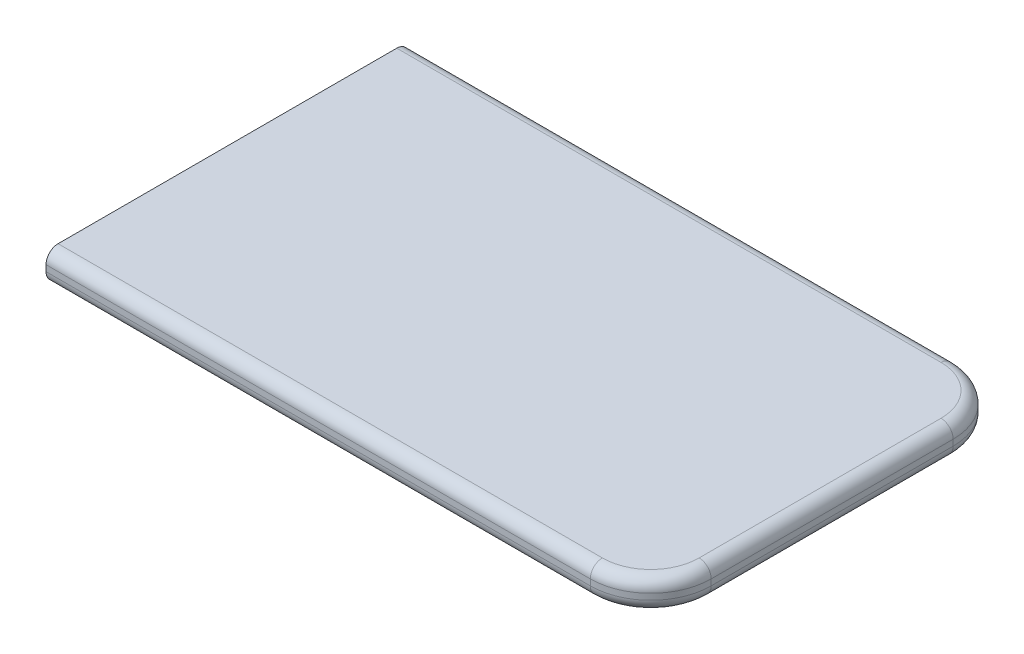
ISO-10303-21;
HEADER;
FILE_DESCRIPTION(('STEP AP214'),'2;1');
FILE_NAME('part.step','',(''),(''),'','','');
FILE_SCHEMA(('AUTOMOTIVE_DESIGN { 1 0 10303 214 1 1 1 1 }'));
ENDSEC;
DATA;
#1=APPLICATION_CONTEXT('core data for automotive mechanical design processes');
#2=APPLICATION_PROTOCOL_DEFINITION('international standard','automotive_design',2000,#1);
#3=PRODUCT_CONTEXT('',#1,'mechanical');
#4=PRODUCT('Part','Part','',(#3));
#5=PRODUCT_RELATED_PRODUCT_CATEGORY('part','',(#4));
#6=PRODUCT_DEFINITION_FORMATION('','',#4);
#7=PRODUCT_DEFINITION_CONTEXT('part definition',#1,'design');
#8=PRODUCT_DEFINITION('design','',#6,#7);
#9=PRODUCT_DEFINITION_SHAPE('','',#8);
#10=(LENGTH_UNIT() NAMED_UNIT(*) SI_UNIT(.MILLI.,.METRE.));
#11=(NAMED_UNIT(*) PLANE_ANGLE_UNIT() SI_UNIT($,.RADIAN.));
#12=(NAMED_UNIT(*) SI_UNIT($,.STERADIAN.) SOLID_ANGLE_UNIT());
#13=UNCERTAINTY_MEASURE_WITH_UNIT(LENGTH_MEASURE(1.E-05),#10,'distance_accuracy_value','');
#14=(GEOMETRIC_REPRESENTATION_CONTEXT(3) GLOBAL_UNCERTAINTY_ASSIGNED_CONTEXT((#13)) GLOBAL_UNIT_ASSIGNED_CONTEXT((#10,
#11,#12)) REPRESENTATION_CONTEXT('',''));
#15=CARTESIAN_POINT('',(0.,0.,0.));
#16=DIRECTION('',(0.,0.,1.));
#17=DIRECTION('',(1.,0.,0.));
#18=AXIS2_PLACEMENT_3D('',#15,#16,#17);
#19=CARTESIAN_POINT('',(0.,50.,0.));
#20=DIRECTION('',(-1.,0.,0.));
#21=DIRECTION('',(0.,0.,1.));
#22=AXIS2_PLACEMENT_3D('',#19,#20,#21);
#23=PLANE('',#22);
#24=DIRECTION('',(0.,-1.,0.));
#25=VECTOR('',#24,1.);
#26=CARTESIAN_POINT('',(0.,0.,-100.));
#27=LINE('',#26,#25);
#28=CARTESIAN_POINT('',(0.,30.,-100.));
#29=VERTEX_POINT('',#28);
#30=CARTESIAN_POINT('',(0.,20.,-100.));
#31=VERTEX_POINT('',#30);
#32=EDGE_CURVE('E156',#29,#31,#27,.T.);
#33=ORIENTED_EDGE('',*,*,#32,.T.);
#34=DIRECTION('',(0.,0.,-1.));
#35=VECTOR('',#34,1.);
#36=CARTESIAN_POINT('',(0.,20.,0.));
#37=LINE('',#36,#35);
#38=CARTESIAN_POINT('',(0.,20.,-500.));
#39=VERTEX_POINT('',#38);
#40=EDGE_CURVE('E272',#31,#39,#37,.T.);
#41=ORIENTED_EDGE('',*,*,#40,.T.);
#42=DIRECTION('',(0.,-1.,0.));
#43=VECTOR('',#42,1.);
#44=CARTESIAN_POINT('',(0.,50.,-500.));
#45=LINE('',#44,#43);
#46=CARTESIAN_POINT('',(0.,30.,-500.));
#47=VERTEX_POINT('',#46);
#48=EDGE_CURVE('E233',#39,#47,#45,.F.);
#49=ORIENTED_EDGE('',*,*,#48,.T.);
#50=DIRECTION('',(0.,0.,-1.));
#51=VECTOR('',#50,1.);
#52=CARTESIAN_POINT('',(0.,30.,-100.));
#53=LINE('',#52,#51);
#54=EDGE_CURVE('E269',#47,#29,#53,.F.);
#55=ORIENTED_EDGE('',*,*,#54,.T.);
#56=EDGE_LOOP('',(#33,#41,#49,#55));
#57=FACE_BOUND('',#56,.T.);
#58=ADVANCED_FACE('F41',(#57),#23,.F.);
#59=CARTESIAN_POINT('',(0.,50.,-600.));
#60=DIRECTION('',(0.,0.,1.));
#61=DIRECTION('',(1.,0.,0.));
#62=AXIS2_PLACEMENT_3D('',#59,#60,#61);
#63=PLANE('',#62);
#64=DIRECTION('',(0.,-1.,0.));
#65=VECTOR('',#64,1.);
#66=CARTESIAN_POINT('',(-100.,50.,-600.));
#67=LINE('',#66,#65);
#68=CARTESIAN_POINT('',(-100.,30.,-600.));
#69=VERTEX_POINT('',#68);
#70=CARTESIAN_POINT('',(-100.,20.,-600.));
#71=VERTEX_POINT('',#70);
#72=EDGE_CURVE('E137',#69,#71,#67,.T.);
#73=ORIENTED_EDGE('',*,*,#72,.T.);
#74=DIRECTION('',(-1.,0.,0.));
#75=VECTOR('',#74,1.);
#76=CARTESIAN_POINT('',(0.,20.,-600.));
#77=LINE('',#76,#75);
#78=CARTESIAN_POINT('',(-1000.,20.,-600.));
#79=VERTEX_POINT('',#78);
#80=EDGE_CURVE('E144',#71,#79,#77,.T.);
#81=ORIENTED_EDGE('',*,*,#80,.T.);
#82=DIRECTION('',(0.,-1.,0.));
#83=VECTOR('',#82,1.);
#84=CARTESIAN_POINT('',(-1000.,50.,-600.));
#85=LINE('',#84,#83);
#86=CARTESIAN_POINT('',(-1000.,30.,-600.));
#87=VERTEX_POINT('',#86);
#88=EDGE_CURVE('E140',#87,#79,#85,.T.);
#89=ORIENTED_EDGE('',*,*,#88,.F.);
#90=DIRECTION('',(-1.,0.,0.));
#91=VECTOR('',#90,1.);
#92=CARTESIAN_POINT('',(-100.,30.,-600.));
#93=LINE('',#92,#91);
#94=EDGE_CURVE('E133',#87,#69,#93,.F.);
#95=ORIENTED_EDGE('',*,*,#94,.T.);
#96=EDGE_LOOP('',(#73,#81,#89,#95));
#97=FACE_BOUND('',#96,.T.);
#98=ADVANCED_FACE('F135',(#97),#63,.F.);
#99=CARTESIAN_POINT('',(-1000.,50.,1.22464679914735E-13));
#100=DIRECTION('',(-1.,0.,0.));
#101=DIRECTION('',(0.,0.,1.));
#102=AXIS2_PLACEMENT_3D('',#99,#100,#101);
#103=PLANE('',#102);
#104=ORIENTED_EDGE('',*,*,#88,.T.);
#105=CARTESIAN_POINT('',(-1000.,20.,-580.));
#106=DIRECTION('',(-1.,0.,0.));
#107=DIRECTION('',(0.,0.,1.));
#108=AXIS2_PLACEMENT_3D('',#105,#106,#107);
#109=CIRCLE('',#108,20.);
#110=CARTESIAN_POINT('',(-1000.,0.,-580.));
#111=VERTEX_POINT('',#110);
#112=EDGE_CURVE('E250',#79,#111,#109,.T.);
#113=ORIENTED_EDGE('',*,*,#112,.T.);
#114=DIRECTION('',(0.,0.,-1.));
#115=VECTOR('',#114,1.);
#116=CARTESIAN_POINT('',(-1000.,0.,1.22464679914735E-13));
#117=LINE('',#116,#115);
#118=CARTESIAN_POINT('',(-1000.,0.,-19.9999999999999));
#119=VERTEX_POINT('',#118);
#120=EDGE_CURVE('E209',#119,#111,#117,.T.);
#121=ORIENTED_EDGE('',*,*,#120,.F.);
#122=CARTESIAN_POINT('',(-1000.,20.,-19.9999999999999));
#123=DIRECTION('',(-1.,0.,0.));
#124=DIRECTION('',(0.,0.,1.));
#125=AXIS2_PLACEMENT_3D('',#122,#123,#124);
#126=CIRCLE('',#125,20.);
#127=CARTESIAN_POINT('',(-1000.,20.,1.22464679914735E-13));
#128=VERTEX_POINT('',#127);
#129=EDGE_CURVE('E244',#119,#128,#126,.T.);
#130=ORIENTED_EDGE('',*,*,#129,.T.);
#131=DIRECTION('',(0.,-1.,0.));
#132=VECTOR('',#131,1.);
#133=CARTESIAN_POINT('',(-1000.,50.,1.22464679914735E-13));
#134=LINE('',#133,#132);
#135=CARTESIAN_POINT('',(-1000.,30.,1.22464679914735E-13));
#136=VERTEX_POINT('',#135);
#137=EDGE_CURVE('E222',#136,#128,#134,.T.);
#138=ORIENTED_EDGE('',*,*,#137,.F.);
#139=CARTESIAN_POINT('',(-1000.,30.,-19.9999999999999));
#140=DIRECTION('',(-1.,0.,0.));
#141=DIRECTION('',(0.,0.,1.));
#142=AXIS2_PLACEMENT_3D('',#139,#140,#141);
#143=CIRCLE('',#142,20.);
#144=CARTESIAN_POINT('',(-1000.,50.,-19.9999999999999));
#145=VERTEX_POINT('',#144);
#146=EDGE_CURVE('E241',#136,#145,#143,.T.);
#147=ORIENTED_EDGE('',*,*,#146,.T.);
#148=DIRECTION('',(0.,0.,-1.));
#149=VECTOR('',#148,1.);
#150=CARTESIAN_POINT('',(-1000.,50.,1.22464679914735E-13));
#151=LINE('',#150,#149);
#152=CARTESIAN_POINT('',(-1000.,50.,-580.));
#153=VERTEX_POINT('',#152);
#154=EDGE_CURVE('E216',#145,#153,#151,.T.);
#155=ORIENTED_EDGE('',*,*,#154,.T.);
#156=CARTESIAN_POINT('',(-1000.,30.,-580.));
#157=DIRECTION('',(-1.,0.,0.));
#158=DIRECTION('',(0.,0.,1.));
#159=AXIS2_PLACEMENT_3D('',#156,#157,#158);
#160=CIRCLE('',#159,20.);
#161=EDGE_CURVE('E247',#153,#87,#160,.T.);
#162=ORIENTED_EDGE('',*,*,#161,.T.);
#163=EDGE_LOOP('',(#104,#113,#121,#130,#138,#147,#155,#162));
#164=FACE_BOUND('',#163,.T.);
#165=ADVANCED_FACE('F302',(#164),#103,.T.);
#166=CARTESIAN_POINT('',(0.,50.,0.));
#167=DIRECTION('',(0.,0.,1.));
#168=DIRECTION('',(1.,0.,0.));
#169=AXIS2_PLACEMENT_3D('',#166,#167,#168);
#170=PLANE('',#169);
#171=ORIENTED_EDGE('',*,*,#137,.T.);
#172=DIRECTION('',(-1.,0.,0.));
#173=VECTOR('',#172,1.);
#174=CARTESIAN_POINT('',(-100.,20.,0.));
#175=LINE('',#174,#173);
#176=CARTESIAN_POINT('',(-100.,20.,0.));
#177=VERTEX_POINT('',#176);
#178=EDGE_CURVE('E11',#128,#177,#175,.F.);
#179=ORIENTED_EDGE('',*,*,#178,.T.);
#180=DIRECTION('',(0.,-1.,0.));
#181=VECTOR('',#180,1.);
#182=CARTESIAN_POINT('',(-100.,50.,0.));
#183=LINE('',#182,#181);
#184=CARTESIAN_POINT('',(-100.,30.,0.));
#185=VERTEX_POINT('',#184);
#186=EDGE_CURVE('E145',#177,#185,#183,.F.);
#187=ORIENTED_EDGE('',*,*,#186,.T.);
#188=DIRECTION('',(-1.,0.,0.));
#189=VECTOR('',#188,1.);
#190=CARTESIAN_POINT('',(0.,30.,0.));
#191=LINE('',#190,#189);
#192=EDGE_CURVE('E51',#185,#136,#191,.T.);
#193=ORIENTED_EDGE('',*,*,#192,.T.);
#194=EDGE_LOOP('',(#171,#179,#187,#193));
#195=FACE_BOUND('',#194,.T.);
#196=ADVANCED_FACE('F296',(#195),#170,.T.);
#197=CARTESIAN_POINT('',(0.,50.,0.));
#198=DIRECTION('',(0.,1.,0.));
#199=DIRECTION('',(0.,0.,1.));
#200=AXIS2_PLACEMENT_3D('',#197,#198,#199);
#201=PLANE('',#200);
#202=CARTESIAN_POINT('',(-100.,50.,-500.));
#203=DIRECTION('',(0.,1.,0.));
#204=DIRECTION('',(0.,0.,1.));
#205=AXIS2_PLACEMENT_3D('',#202,#203,#204);
#206=CIRCLE('',#205,80.);
#207=CARTESIAN_POINT('',(-20.,50.,-500.));
#208=VERTEX_POINT('',#207);
#209=CARTESIAN_POINT('',(-100.,50.,-580.));
#210=VERTEX_POINT('',#209);
#211=EDGE_CURVE('E59',#208,#210,#206,.T.);
#212=ORIENTED_EDGE('',*,*,#211,.T.);
#213=DIRECTION('',(-1.,0.,0.));
#214=VECTOR('',#213,1.);
#215=CARTESIAN_POINT('',(-1000.,50.,-580.));
#216=LINE('',#215,#214);
#217=EDGE_CURVE('E168',#210,#153,#216,.T.);
#218=ORIENTED_EDGE('',*,*,#217,.T.);
#219=ORIENTED_EDGE('',*,*,#154,.F.);
#220=DIRECTION('',(-1.,0.,0.));
#221=VECTOR('',#220,1.);
#222=CARTESIAN_POINT('',(0.,50.,-20.));
#223=LINE('',#222,#221);
#224=CARTESIAN_POINT('',(-100.,50.,-20.));
#225=VERTEX_POINT('',#224);
#226=EDGE_CURVE('E281',#145,#225,#223,.F.);
#227=ORIENTED_EDGE('',*,*,#226,.T.);
#228=CARTESIAN_POINT('',(-100.,50.,-100.));
#229=DIRECTION('',(0.,1.,0.));
#230=DIRECTION('',(0.,0.,1.));
#231=AXIS2_PLACEMENT_3D('',#228,#229,#230);
#232=CIRCLE('',#231,80.);
#233=CARTESIAN_POINT('',(-20.,50.,-100.));
#234=VERTEX_POINT('',#233);
#235=EDGE_CURVE('E284',#225,#234,#232,.T.);
#236=ORIENTED_EDGE('',*,*,#235,.T.);
#237=DIRECTION('',(0.,0.,-1.));
#238=VECTOR('',#237,1.);
#239=CARTESIAN_POINT('',(-20.,50.,-500.));
#240=LINE('',#239,#238);
#241=EDGE_CURVE('E64',#234,#208,#240,.T.);
#242=ORIENTED_EDGE('',*,*,#241,.T.);
#243=EDGE_LOOP('',(#212,#218,#219,#227,#236,#242));
#244=FACE_BOUND('',#243,.T.);
#245=ADVANCED_FACE('F306',(#244),#201,.T.);
#246=CARTESIAN_POINT('',(0.,0.,0.));
#247=DIRECTION('',(0.,1.,0.));
#248=DIRECTION('',(0.,0.,1.));
#249=AXIS2_PLACEMENT_3D('',#246,#247,#248);
#250=PLANE('',#249);
#251=ORIENTED_EDGE('',*,*,#120,.T.);
#252=DIRECTION('',(-1.,0.,0.));
#253=VECTOR('',#252,1.);
#254=CARTESIAN_POINT('',(0.,0.,-580.));
#255=LINE('',#254,#253);
#256=CARTESIAN_POINT('',(-100.,0.,-580.));
#257=VERTEX_POINT('',#256);
#258=EDGE_CURVE('E165',#111,#257,#255,.F.);
#259=ORIENTED_EDGE('',*,*,#258,.T.);
#260=CARTESIAN_POINT('',(-100.,0.,-500.));
#261=DIRECTION('',(0.,1.,0.));
#262=DIRECTION('',(0.,0.,1.));
#263=AXIS2_PLACEMENT_3D('',#260,#261,#262);
#264=CIRCLE('',#263,80.);
#265=CARTESIAN_POINT('',(-20.,0.,-500.));
#266=VERTEX_POINT('',#265);
#267=EDGE_CURVE('E262',#257,#266,#264,.F.);
#268=ORIENTED_EDGE('',*,*,#267,.T.);
#269=DIRECTION('',(0.,0.,-1.));
#270=VECTOR('',#269,1.);
#271=CARTESIAN_POINT('',(-20.,0.,0.));
#272=LINE('',#271,#270);
#273=CARTESIAN_POINT('',(-20.,0.,-100.));
#274=VERTEX_POINT('',#273);
#275=EDGE_CURVE('E259',#266,#274,#272,.F.);
#276=ORIENTED_EDGE('',*,*,#275,.T.);
#277=CARTESIAN_POINT('',(-100.,0.,-100.));
#278=DIRECTION('',(0.,1.,0.));
#279=DIRECTION('',(0.,0.,1.));
#280=AXIS2_PLACEMENT_3D('',#277,#278,#279);
#281=CIRCLE('',#280,80.);
#282=CARTESIAN_POINT('',(-100.,0.,-20.));
#283=VERTEX_POINT('',#282);
#284=EDGE_CURVE('E256',#274,#283,#281,.F.);
#285=ORIENTED_EDGE('',*,*,#284,.T.);
#286=DIRECTION('',(-1.,0.,0.));
#287=VECTOR('',#286,1.);
#288=CARTESIAN_POINT('',(-1000.,0.,-19.9999999999999));
#289=LINE('',#288,#287);
#290=EDGE_CURVE('E253',#283,#119,#289,.T.);
#291=ORIENTED_EDGE('',*,*,#290,.T.);
#292=EDGE_LOOP('',(#251,#259,#268,#276,#285,#291));
#293=FACE_BOUND('',#292,.T.);
#294=ADVANCED_FACE('F309',(#293),#250,.F.);
#295=CARTESIAN_POINT('',(-100.,50.,-500.));
#296=DIRECTION('',(0.,-1.,0.));
#297=DIRECTION('',(0.,0.,-1.));
#298=AXIS2_PLACEMENT_3D('',#295,#296,#297);
#299=CYLINDRICAL_SURFACE('',#298,100.);
#300=ORIENTED_EDGE('',*,*,#48,.F.);
#301=CARTESIAN_POINT('',(-100.,20.,-500.));
#302=DIRECTION('',(0.,1.,0.));
#303=DIRECTION('',(0.,0.,1.));
#304=AXIS2_PLACEMENT_3D('',#301,#302,#303);
#305=CIRCLE('',#304,100.);
#306=EDGE_CURVE('E154',#39,#71,#305,.T.);
#307=ORIENTED_EDGE('',*,*,#306,.T.);
#308=ORIENTED_EDGE('',*,*,#72,.F.);
#309=CARTESIAN_POINT('',(-100.,30.,-500.));
#310=DIRECTION('',(0.,1.,0.));
#311=DIRECTION('',(0.,0.,1.));
#312=AXIS2_PLACEMENT_3D('',#309,#310,#311);
#313=CIRCLE('',#312,100.);
#314=EDGE_CURVE('E151',#69,#47,#313,.F.);
#315=ORIENTED_EDGE('',*,*,#314,.T.);
#316=EDGE_LOOP('',(#300,#307,#308,#315));
#317=FACE_BOUND('',#316,.T.);
#318=ADVANCED_FACE('F150',(#317),#299,.T.);
#319=CARTESIAN_POINT('',(-100.,50.,-100.));
#320=DIRECTION('',(0.,1.,0.));
#321=DIRECTION('',(0.,0.,1.));
#322=AXIS2_PLACEMENT_3D('',#319,#320,#321);
#323=CYLINDRICAL_SURFACE('',#322,100.);
#324=ORIENTED_EDGE('',*,*,#186,.F.);
#325=CARTESIAN_POINT('',(-100.,20.,-100.));
#326=DIRECTION('',(0.,1.,0.));
#327=DIRECTION('',(0.,0.,1.));
#328=AXIS2_PLACEMENT_3D('',#325,#326,#327);
#329=CIRCLE('',#328,100.);
#330=EDGE_CURVE('E278',#177,#31,#329,.T.);
#331=ORIENTED_EDGE('',*,*,#330,.T.);
#332=ORIENTED_EDGE('',*,*,#32,.F.);
#333=CARTESIAN_POINT('',(-100.,30.,-100.));
#334=DIRECTION('',(0.,1.,0.));
#335=DIRECTION('',(0.,0.,1.));
#336=AXIS2_PLACEMENT_3D('',#333,#334,#335);
#337=CIRCLE('',#336,100.);
#338=EDGE_CURVE('E275',#29,#185,#337,.F.);
#339=ORIENTED_EDGE('',*,*,#338,.T.);
#340=EDGE_LOOP('',(#324,#331,#332,#339));
#341=FACE_BOUND('',#340,.T.);
#342=ADVANCED_FACE('F318',(#341),#323,.T.);
#343=CARTESIAN_POINT('',(0.,20.,-20.));
#344=DIRECTION('',(1.,0.,0.));
#345=DIRECTION('',(0.,0.,-1.));
#346=AXIS2_PLACEMENT_3D('',#343,#344,#345);
#347=CYLINDRICAL_SURFACE('',#346,20.);
#348=ORIENTED_EDGE('',*,*,#129,.F.);
#349=ORIENTED_EDGE('',*,*,#290,.F.);
#350=CARTESIAN_POINT('',(-100.,20.,-20.));
#351=DIRECTION('',(1.,0.,0.));
#352=DIRECTION('',(0.,0.,-1.));
#353=AXIS2_PLACEMENT_3D('',#350,#351,#352);
#354=CIRCLE('',#353,20.);
#355=EDGE_CURVE('E175',#177,#283,#354,.T.);
#356=ORIENTED_EDGE('',*,*,#355,.F.);
#357=ORIENTED_EDGE('',*,*,#178,.F.);
#358=EDGE_LOOP('',(#348,#349,#356,#357));
#359=FACE_BOUND('',#358,.T.);
#360=ADVANCED_FACE('F341',(#359),#347,.T.);
#361=CARTESIAN_POINT('',(-100.,20.,-100.));
#362=DIRECTION('',(0.,1.,0.));
#363=DIRECTION('',(0.,0.,1.));
#364=AXIS2_PLACEMENT_3D('',#361,#362,#363);
#365=TOROIDAL_SURFACE('',#364,80.,20.);
#366=ORIENTED_EDGE('',*,*,#355,.T.);
#367=ORIENTED_EDGE('',*,*,#284,.F.);
#368=CARTESIAN_POINT('',(-20.,20.,-100.));
#369=DIRECTION('',(0.,0.,-1.));
#370=DIRECTION('',(-1.,0.,0.));
#371=AXIS2_PLACEMENT_3D('',#368,#369,#370);
#372=CIRCLE('',#371,20.);
#373=EDGE_CURVE('E198',#31,#274,#372,.T.);
#374=ORIENTED_EDGE('',*,*,#373,.F.);
#375=ORIENTED_EDGE('',*,*,#330,.F.);
#376=EDGE_LOOP('',(#366,#367,#374,#375));
#377=FACE_BOUND('',#376,.T.);
#378=ADVANCED_FACE('F315',(#377),#365,.T.);
#379=CARTESIAN_POINT('',(-20.,20.,0.));
#380=DIRECTION('',(0.,0.,-1.));
#381=DIRECTION('',(-1.,0.,0.));
#382=AXIS2_PLACEMENT_3D('',#379,#380,#381);
#383=CYLINDRICAL_SURFACE('',#382,20.);
#384=ORIENTED_EDGE('',*,*,#373,.T.);
#385=ORIENTED_EDGE('',*,*,#275,.F.);
#386=CARTESIAN_POINT('',(-20.,20.,-500.));
#387=DIRECTION('',(0.,0.,-1.));
#388=DIRECTION('',(-1.,0.,0.));
#389=AXIS2_PLACEMENT_3D('',#386,#387,#388);
#390=CIRCLE('',#389,20.);
#391=EDGE_CURVE('E191',#39,#266,#390,.T.);
#392=ORIENTED_EDGE('',*,*,#391,.F.);
#393=ORIENTED_EDGE('',*,*,#40,.F.);
#394=EDGE_LOOP('',(#384,#385,#392,#393));
#395=FACE_BOUND('',#394,.T.);
#396=ADVANCED_FACE('F313',(#395),#383,.T.);
#397=CARTESIAN_POINT('',(-100.,20.,-500.));
#398=DIRECTION('',(0.,1.,0.));
#399=DIRECTION('',(0.,0.,1.));
#400=AXIS2_PLACEMENT_3D('',#397,#398,#399);
#401=TOROIDAL_SURFACE('',#400,80.,20.);
#402=ORIENTED_EDGE('',*,*,#391,.T.);
#403=ORIENTED_EDGE('',*,*,#267,.F.);
#404=CARTESIAN_POINT('',(-100.,20.,-580.));
#405=DIRECTION('',(-1.,0.,0.));
#406=DIRECTION('',(0.,0.,1.));
#407=AXIS2_PLACEMENT_3D('',#404,#405,#406);
#408=CIRCLE('',#407,20.);
#409=EDGE_CURVE('E184',#71,#257,#408,.T.);
#410=ORIENTED_EDGE('',*,*,#409,.F.);
#411=ORIENTED_EDGE('',*,*,#306,.F.);
#412=EDGE_LOOP('',(#402,#403,#410,#411));
#413=FACE_BOUND('',#412,.T.);
#414=ADVANCED_FACE('F311',(#413),#401,.T.);
#415=CARTESIAN_POINT('',(0.,20.,-580.));
#416=DIRECTION('',(-1.,0.,0.));
#417=DIRECTION('',(0.,0.,1.));
#418=AXIS2_PLACEMENT_3D('',#415,#416,#417);
#419=CYLINDRICAL_SURFACE('',#418,20.);
#420=ORIENTED_EDGE('',*,*,#409,.T.);
#421=ORIENTED_EDGE('',*,*,#258,.F.);
#422=ORIENTED_EDGE('',*,*,#112,.F.);
#423=ORIENTED_EDGE('',*,*,#80,.F.);
#424=EDGE_LOOP('',(#420,#421,#422,#423));
#425=FACE_BOUND('',#424,.T.);
#426=ADVANCED_FACE('F307',(#425),#419,.T.);
#427=CARTESIAN_POINT('',(0.,30.,-20.));
#428=DIRECTION('',(-1.,0.,0.));
#429=DIRECTION('',(0.,0.,1.));
#430=AXIS2_PLACEMENT_3D('',#427,#428,#429);
#431=CYLINDRICAL_SURFACE('',#430,20.);
#432=ORIENTED_EDGE('',*,*,#146,.F.);
#433=ORIENTED_EDGE('',*,*,#192,.F.);
#434=CARTESIAN_POINT('',(-100.,30.,-20.));
#435=DIRECTION('',(1.,0.,0.));
#436=DIRECTION('',(0.,0.,-1.));
#437=AXIS2_PLACEMENT_3D('',#434,#435,#436);
#438=CIRCLE('',#437,20.);
#439=EDGE_CURVE('E45',#225,#185,#438,.T.);
#440=ORIENTED_EDGE('',*,*,#439,.F.);
#441=ORIENTED_EDGE('',*,*,#226,.F.);
#442=EDGE_LOOP('',(#432,#433,#440,#441));
#443=FACE_BOUND('',#442,.T.);
#444=ADVANCED_FACE('F43',(#443),#431,.T.);
#445=CARTESIAN_POINT('',(-100.,30.,-100.));
#446=DIRECTION('',(0.,1.,0.));
#447=DIRECTION('',(0.,0.,1.));
#448=AXIS2_PLACEMENT_3D('',#445,#446,#447);
#449=TOROIDAL_SURFACE('',#448,80.,20.);
#450=ORIENTED_EDGE('',*,*,#439,.T.);
#451=ORIENTED_EDGE('',*,*,#338,.F.);
#452=CARTESIAN_POINT('',(-20.,30.,-100.));
#453=DIRECTION('',(0.,0.,-1.));
#454=DIRECTION('',(-1.,0.,0.));
#455=AXIS2_PLACEMENT_3D('',#452,#453,#454);
#456=CIRCLE('',#455,20.);
#457=EDGE_CURVE('E172',#234,#29,#456,.T.);
#458=ORIENTED_EDGE('',*,*,#457,.F.);
#459=ORIENTED_EDGE('',*,*,#235,.F.);
#460=EDGE_LOOP('',(#450,#451,#458,#459));
#461=FACE_BOUND('',#460,.T.);
#462=ADVANCED_FACE('F322',(#461),#449,.T.);
#463=CARTESIAN_POINT('',(-20.,30.,0.));
#464=DIRECTION('',(0.,0.,1.));
#465=DIRECTION('',(1.,0.,0.));
#466=AXIS2_PLACEMENT_3D('',#463,#464,#465);
#467=CYLINDRICAL_SURFACE('',#466,20.);
#468=ORIENTED_EDGE('',*,*,#457,.T.);
#469=ORIENTED_EDGE('',*,*,#54,.F.);
#470=CARTESIAN_POINT('',(-20.,30.,-500.));
#471=DIRECTION('',(0.,0.,-1.));
#472=DIRECTION('',(-1.,0.,0.));
#473=AXIS2_PLACEMENT_3D('',#470,#471,#472);
#474=CIRCLE('',#473,20.);
#475=EDGE_CURVE('E163',#208,#47,#474,.T.);
#476=ORIENTED_EDGE('',*,*,#475,.F.);
#477=ORIENTED_EDGE('',*,*,#241,.F.);
#478=EDGE_LOOP('',(#468,#469,#476,#477));
#479=FACE_BOUND('',#478,.T.);
#480=ADVANCED_FACE('F320',(#479),#467,.T.);
#481=CARTESIAN_POINT('',(-100.,30.,-500.));
#482=DIRECTION('',(0.,1.,0.));
#483=DIRECTION('',(0.,0.,1.));
#484=AXIS2_PLACEMENT_3D('',#481,#482,#483);
#485=TOROIDAL_SURFACE('',#484,80.,20.);
#486=ORIENTED_EDGE('',*,*,#475,.T.);
#487=ORIENTED_EDGE('',*,*,#314,.F.);
#488=CARTESIAN_POINT('',(-100.,30.,-580.));
#489=DIRECTION('',(-1.,0.,0.));
#490=DIRECTION('',(0.,0.,1.));
#491=AXIS2_PLACEMENT_3D('',#488,#489,#490);
#492=CIRCLE('',#491,20.);
#493=EDGE_CURVE('E161',#210,#69,#492,.T.);
#494=ORIENTED_EDGE('',*,*,#493,.F.);
#495=ORIENTED_EDGE('',*,*,#211,.F.);
#496=EDGE_LOOP('',(#486,#487,#494,#495));
#497=FACE_BOUND('',#496,.T.);
#498=ADVANCED_FACE('F160',(#497),#485,.T.);
#499=CARTESIAN_POINT('',(0.,30.,-580.));
#500=DIRECTION('',(1.,0.,0.));
#501=DIRECTION('',(0.,0.,-1.));
#502=AXIS2_PLACEMENT_3D('',#499,#500,#501);
#503=CYLINDRICAL_SURFACE('',#502,20.);
#504=ORIENTED_EDGE('',*,*,#493,.T.);
#505=ORIENTED_EDGE('',*,*,#94,.F.);
#506=ORIENTED_EDGE('',*,*,#161,.F.);
#507=ORIENTED_EDGE('',*,*,#217,.F.);
#508=EDGE_LOOP('',(#504,#505,#506,#507));
#509=FACE_BOUND('',#508,.T.);
#510=ADVANCED_FACE('F167',(#509),#503,.T.);
#511=CLOSED_SHELL('',(#58,#98,#165,#196,#245,#294,#318,#342,#360,#378,#396,#414,#426,#444,#462,
#480,#498,#510));
#512=MANIFOLD_SOLID_BREP('B2',#511);
#513=ADVANCED_BREP_SHAPE_REPRESENTATION('',(#18,#512),#14);
#514=SHAPE_DEFINITION_REPRESENTATION(#9,#513);
ENDSEC;
END-ISO-10303-21;
